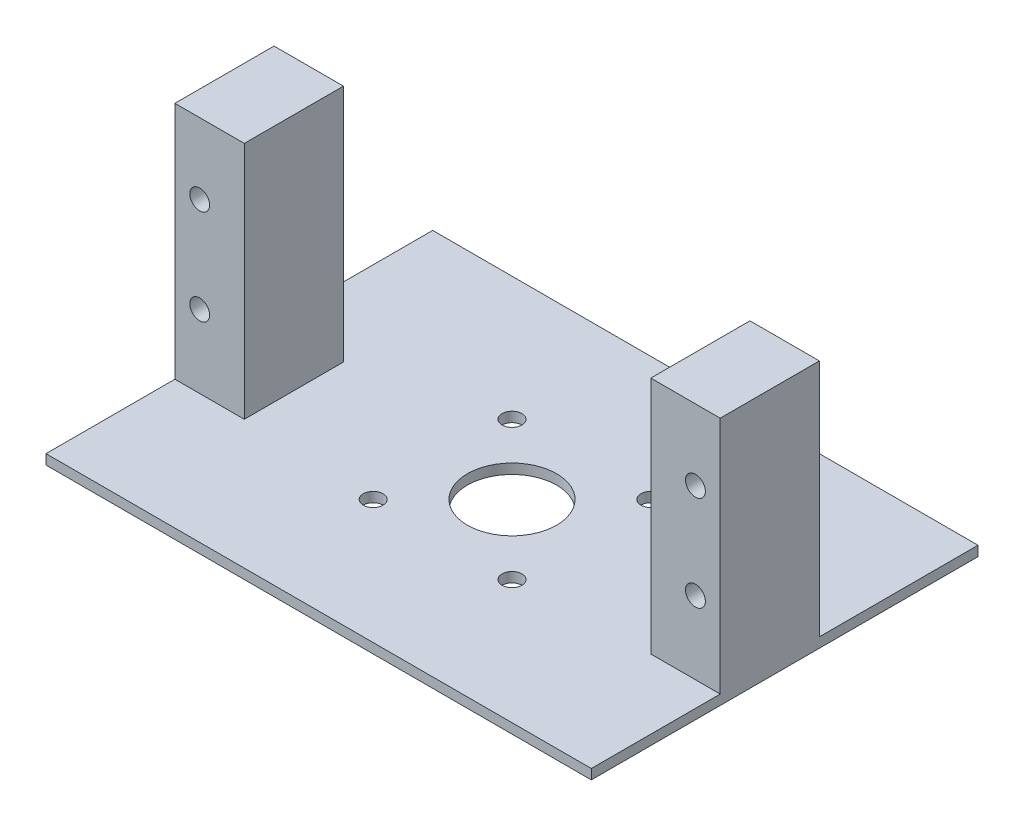
ISO-10303-21;
HEADER;
FILE_DESCRIPTION(('STEP AP214'),'2;1');
FILE_NAME('part.step','',(''),(''),'','','');
FILE_SCHEMA(('AUTOMOTIVE_DESIGN { 1 0 10303 214 1 1 1 1 }'));
ENDSEC;
DATA;
#1=APPLICATION_CONTEXT('core data for automotive mechanical design processes');
#2=APPLICATION_PROTOCOL_DEFINITION('international standard','automotive_design',2000,#1);
#3=PRODUCT_CONTEXT('',#1,'mechanical');
#4=PRODUCT('Part','Part','',(#3));
#5=PRODUCT_RELATED_PRODUCT_CATEGORY('part','',(#4));
#6=PRODUCT_DEFINITION_FORMATION('','',#4);
#7=PRODUCT_DEFINITION_CONTEXT('part definition',#1,'design');
#8=PRODUCT_DEFINITION('design','',#6,#7);
#9=PRODUCT_DEFINITION_SHAPE('','',#8);
#10=(LENGTH_UNIT() NAMED_UNIT(*) SI_UNIT(.MILLI.,.METRE.));
#11=(NAMED_UNIT(*) PLANE_ANGLE_UNIT() SI_UNIT($,.RADIAN.));
#12=(NAMED_UNIT(*) SI_UNIT($,.STERADIAN.) SOLID_ANGLE_UNIT());
#13=UNCERTAINTY_MEASURE_WITH_UNIT(LENGTH_MEASURE(1.E-05),#10,'distance_accuracy_value','');
#14=(GEOMETRIC_REPRESENTATION_CONTEXT(3) GLOBAL_UNCERTAINTY_ASSIGNED_CONTEXT((#13)) GLOBAL_UNIT_ASSIGNED_CONTEXT((#10,
#11,#12)) REPRESENTATION_CONTEXT('',''));
#15=CARTESIAN_POINT('',(0.,0.,0.));
#16=DIRECTION('',(0.,0.,1.));
#17=DIRECTION('',(1.,0.,0.));
#18=AXIS2_PLACEMENT_3D('',#15,#16,#17);
#19=CARTESIAN_POINT('',(0.,1.,0.));
#20=DIRECTION('',(0.,-1.,0.));
#21=DIRECTION('',(0.,0.,-1.));
#22=AXIS2_PLACEMENT_3D('',#19,#20,#21);
#23=PLANE('',#22);
#24=CARTESIAN_POINT('',(20.5,1.,-26.5));
#25=DIRECTION('',(0.,1.,0.));
#26=DIRECTION('',(0.,0.,1.));
#27=AXIS2_PLACEMENT_3D('',#24,#25,#26);
#28=CIRCLE('',#27,1.);
#29=CARTESIAN_POINT('',(20.5,1.,-25.5));
#30=VERTEX_POINT('',#29);
#31=EDGE_CURVE('E161',#30,#30,#28,.T.);
#32=ORIENTED_EDGE('',*,*,#31,.F.);
#33=EDGE_LOOP('',(#32));
#34=FACE_BOUND('',#33,.T.);
#35=CARTESIAN_POINT('',(20.5,1.,-12.5));
#36=DIRECTION('',(0.,1.,0.));
#37=DIRECTION('',(0.,0.,1.));
#38=AXIS2_PLACEMENT_3D('',#35,#36,#37);
#39=CIRCLE('',#38,1.);
#40=CARTESIAN_POINT('',(20.5,1.,-11.5));
#41=VERTEX_POINT('',#40);
#42=EDGE_CURVE('E232',#41,#41,#39,.T.);
#43=ORIENTED_EDGE('',*,*,#42,.F.);
#44=EDGE_LOOP('',(#43));
#45=FACE_BOUND('',#44,.T.);
#46=CARTESIAN_POINT('',(34.5,1.,-12.5));
#47=DIRECTION('',(0.,1.,0.));
#48=DIRECTION('',(0.,0.,1.));
#49=AXIS2_PLACEMENT_3D('',#46,#47,#48);
#50=CIRCLE('',#49,0.999999999999998);
#51=CARTESIAN_POINT('',(34.5,1.,-11.5));
#52=VERTEX_POINT('',#51);
#53=EDGE_CURVE('E224',#52,#52,#50,.T.);
#54=ORIENTED_EDGE('',*,*,#53,.F.);
#55=EDGE_LOOP('',(#54));
#56=FACE_BOUND('',#55,.T.);
#57=CARTESIAN_POINT('',(27.5,1.,-19.5));
#58=DIRECTION('',(0.,1.,0.));
#59=DIRECTION('',(0.,0.,1.));
#60=AXIS2_PLACEMENT_3D('',#57,#58,#59);
#61=CIRCLE('',#60,4.5);
#62=CARTESIAN_POINT('',(27.5,1.,-15.));
#63=VERTEX_POINT('',#62);
#64=EDGE_CURVE('E216',#63,#63,#61,.T.);
#65=ORIENTED_EDGE('',*,*,#64,.F.);
#66=EDGE_LOOP('',(#65));
#67=FACE_BOUND('',#66,.T.);
#68=CARTESIAN_POINT('',(34.5,1.,-26.5));
#69=DIRECTION('',(0.,1.,0.));
#70=DIRECTION('',(0.,0.,1.));
#71=AXIS2_PLACEMENT_3D('',#68,#69,#70);
#72=CIRCLE('',#71,0.999999999999998);
#73=CARTESIAN_POINT('',(34.5,1.,-25.5));
#74=VERTEX_POINT('',#73);
#75=EDGE_CURVE('E239',#74,#74,#72,.T.);
#76=ORIENTED_EDGE('',*,*,#75,.F.);
#77=EDGE_LOOP('',(#76));
#78=FACE_BOUND('',#77,.T.);
#79=DIRECTION('',(1.,0.,0.));
#80=VECTOR('',#79,1.);
#81=CARTESIAN_POINT('',(48.,1.,-13.));
#82=LINE('',#81,#80);
#83=CARTESIAN_POINT('',(48.,1.,-13.));
#84=VERTEX_POINT('',#83);
#85=CARTESIAN_POINT('',(55.,1.,-13.));
#86=VERTEX_POINT('',#85);
#87=EDGE_CURVE('E61',#84,#86,#82,.T.);
#88=ORIENTED_EDGE('',*,*,#87,.F.);
#89=DIRECTION('',(0.,0.,1.));
#90=VECTOR('',#89,1.);
#91=CARTESIAN_POINT('',(48.,1.,-23.));
#92=LINE('',#91,#90);
#93=CARTESIAN_POINT('',(48.,1.,-23.));
#94=VERTEX_POINT('',#93);
#95=EDGE_CURVE('E157',#94,#84,#92,.T.);
#96=ORIENTED_EDGE('',*,*,#95,.F.);
#97=DIRECTION('',(-1.,0.,0.));
#98=VECTOR('',#97,1.);
#99=CARTESIAN_POINT('',(55.,1.,-23.));
#100=LINE('',#99,#98);
#101=CARTESIAN_POINT('',(55.,1.,-23.));
#102=VERTEX_POINT('',#101);
#103=EDGE_CURVE('E300',#102,#94,#100,.T.);
#104=ORIENTED_EDGE('',*,*,#103,.F.);
#105=DIRECTION('',(0.,0.,-1.));
#106=VECTOR('',#105,1.);
#107=CARTESIAN_POINT('',(55.,1.,0.));
#108=LINE('',#107,#106);
#109=CARTESIAN_POINT('',(55.,1.,-39.));
#110=VERTEX_POINT('',#109);
#111=EDGE_CURVE('E254',#102,#110,#108,.T.);
#112=ORIENTED_EDGE('',*,*,#111,.T.);
#113=DIRECTION('',(-1.,0.,0.));
#114=VECTOR('',#113,1.);
#115=CARTESIAN_POINT('',(0.,1.,-39.));
#116=LINE('',#115,#114);
#117=CARTESIAN_POINT('',(0.,1.,-39.));
#118=VERTEX_POINT('',#117);
#119=EDGE_CURVE('E258',#110,#118,#116,.T.);
#120=ORIENTED_EDGE('',*,*,#119,.T.);
#121=DIRECTION('',(0.,0.,1.));
#122=VECTOR('',#121,1.);
#123=CARTESIAN_POINT('',(0.,1.,0.));
#124=LINE('',#123,#122);
#125=CARTESIAN_POINT('',(0.,1.,-23.));
#126=VERTEX_POINT('',#125);
#127=EDGE_CURVE('E247',#118,#126,#124,.T.);
#128=ORIENTED_EDGE('',*,*,#127,.T.);
#129=DIRECTION('',(-1.,0.,0.));
#130=VECTOR('',#129,1.);
#131=CARTESIAN_POINT('',(0.,1.,-23.));
#132=LINE('',#131,#130);
#133=CARTESIAN_POINT('',(7.,1.,-23.));
#134=VERTEX_POINT('',#133);
#135=EDGE_CURVE('E68',#134,#126,#132,.T.);
#136=ORIENTED_EDGE('',*,*,#135,.F.);
#137=DIRECTION('',(0.,0.,-1.));
#138=VECTOR('',#137,1.);
#139=CARTESIAN_POINT('',(7.,1.,-23.));
#140=LINE('',#139,#138);
#141=CARTESIAN_POINT('',(7.,1.,-13.));
#142=VERTEX_POINT('',#141);
#143=EDGE_CURVE('E190',#142,#134,#140,.T.);
#144=ORIENTED_EDGE('',*,*,#143,.F.);
#145=DIRECTION('',(1.,0.,0.));
#146=VECTOR('',#145,1.);
#147=CARTESIAN_POINT('',(7.,1.,-13.));
#148=LINE('',#147,#146);
#149=CARTESIAN_POINT('',(0.,1.,-13.));
#150=VERTEX_POINT('',#149);
#151=EDGE_CURVE('E193',#150,#142,#148,.T.);
#152=ORIENTED_EDGE('',*,*,#151,.F.);
#153=CARTESIAN_POINT('',(0.,1.,0.));
#154=VERTEX_POINT('',#153);
#155=EDGE_CURVE('E251',#150,#154,#124,.T.);
#156=ORIENTED_EDGE('',*,*,#155,.T.);
#157=DIRECTION('',(1.,0.,0.));
#158=VECTOR('',#157,1.);
#159=CARTESIAN_POINT('',(0.,1.,0.));
#160=LINE('',#159,#158);
#161=CARTESIAN_POINT('',(55.,1.,0.));
#162=VERTEX_POINT('',#161);
#163=EDGE_CURVE('E250',#154,#162,#160,.T.);
#164=ORIENTED_EDGE('',*,*,#163,.T.);
#165=EDGE_CURVE('E255',#162,#86,#108,.T.);
#166=ORIENTED_EDGE('',*,*,#165,.T.);
#167=EDGE_LOOP('',(#88,#96,#104,#112,#120,#128,#136,#144,#152,#156,#164,#166));
#168=FACE_BOUND('',#167,.T.);
#169=ADVANCED_FACE('F45',(#34,#45,#56,#67,#78,#168),#23,.F.);
#170=CARTESIAN_POINT('',(0.,1.,0.));
#171=DIRECTION('',(1.,0.,0.));
#172=DIRECTION('',(0.,0.,-1.));
#173=AXIS2_PLACEMENT_3D('',#170,#171,#172);
#174=PLANE('',#173);
#175=DIRECTION('',(0.,0.,1.));
#176=VECTOR('',#175,1.);
#177=CARTESIAN_POINT('',(0.,0.,0.));
#178=LINE('',#177,#176);
#179=CARTESIAN_POINT('',(0.,0.,-39.));
#180=VERTEX_POINT('',#179);
#181=CARTESIAN_POINT('',(0.,0.,0.));
#182=VERTEX_POINT('',#181);
#183=EDGE_CURVE('E243',#180,#182,#178,.T.);
#184=ORIENTED_EDGE('',*,*,#183,.T.);
#185=DIRECTION('',(0.,-1.,0.));
#186=VECTOR('',#185,1.);
#187=CARTESIAN_POINT('',(0.,1.,0.));
#188=LINE('',#187,#186);
#189=EDGE_CURVE('E11',#154,#182,#188,.T.);
#190=ORIENTED_EDGE('',*,*,#189,.F.);
#191=ORIENTED_EDGE('',*,*,#155,.F.);
#192=DIRECTION('',(0.,-1.,0.));
#193=VECTOR('',#192,1.);
#194=CARTESIAN_POINT('',(0.,25.1,-13.));
#195=LINE('',#194,#193);
#196=CARTESIAN_POINT('',(0.,25.1,-13.));
#197=VERTEX_POINT('',#196);
#198=EDGE_CURVE('E176',#197,#150,#195,.T.);
#199=ORIENTED_EDGE('',*,*,#198,.F.);
#200=DIRECTION('',(0.,0.,1.));
#201=VECTOR('',#200,1.);
#202=CARTESIAN_POINT('',(0.,25.1,-13.));
#203=LINE('',#202,#201);
#204=CARTESIAN_POINT('',(0.,25.1,-23.));
#205=VERTEX_POINT('',#204);
#206=EDGE_CURVE('E205',#205,#197,#203,.T.);
#207=ORIENTED_EDGE('',*,*,#206,.F.);
#208=DIRECTION('',(0.,-1.,0.));
#209=VECTOR('',#208,1.);
#210=CARTESIAN_POINT('',(0.,25.1,-23.));
#211=LINE('',#210,#209);
#212=EDGE_CURVE('E172',#205,#126,#211,.T.);
#213=ORIENTED_EDGE('',*,*,#212,.T.);
#214=ORIENTED_EDGE('',*,*,#127,.F.);
#215=DIRECTION('',(0.,-1.,0.));
#216=VECTOR('',#215,1.);
#217=CARTESIAN_POINT('',(0.,1.,-39.));
#218=LINE('',#217,#216);
#219=EDGE_CURVE('E261',#118,#180,#218,.T.);
#220=ORIENTED_EDGE('',*,*,#219,.T.);
#221=EDGE_LOOP('',(#184,#190,#191,#199,#207,#213,#214,#220));
#222=FACE_BOUND('',#221,.T.);
#223=ADVANCED_FACE('F47',(#222),#174,.F.);
#224=CARTESIAN_POINT('',(0.,1.,0.));
#225=DIRECTION('',(0.,0.,-1.));
#226=DIRECTION('',(-1.,0.,0.));
#227=AXIS2_PLACEMENT_3D('',#224,#225,#226);
#228=PLANE('',#227);
#229=DIRECTION('',(1.,0.,0.));
#230=VECTOR('',#229,1.);
#231=CARTESIAN_POINT('',(0.,0.,0.));
#232=LINE('',#231,#230);
#233=CARTESIAN_POINT('',(55.,0.,0.));
#234=VERTEX_POINT('',#233);
#235=EDGE_CURVE('E265',#182,#234,#232,.T.);
#236=ORIENTED_EDGE('',*,*,#235,.T.);
#237=DIRECTION('',(0.,-1.,0.));
#238=VECTOR('',#237,1.);
#239=CARTESIAN_POINT('',(55.,1.,0.));
#240=LINE('',#239,#238);
#241=EDGE_CURVE('E54',#162,#234,#240,.T.);
#242=ORIENTED_EDGE('',*,*,#241,.F.);
#243=ORIENTED_EDGE('',*,*,#163,.F.);
#244=ORIENTED_EDGE('',*,*,#189,.T.);
#245=EDGE_LOOP('',(#236,#242,#243,#244));
#246=FACE_BOUND('',#245,.T.);
#247=ADVANCED_FACE('F305',(#246),#228,.F.);
#248=CARTESIAN_POINT('',(55.,1.,0.));
#249=DIRECTION('',(-1.,0.,0.));
#250=DIRECTION('',(0.,0.,1.));
#251=AXIS2_PLACEMENT_3D('',#248,#249,#250);
#252=PLANE('',#251);
#253=DIRECTION('',(0.,0.,-1.));
#254=VECTOR('',#253,1.);
#255=CARTESIAN_POINT('',(55.,0.,0.));
#256=LINE('',#255,#254);
#257=CARTESIAN_POINT('',(55.,0.,-39.));
#258=VERTEX_POINT('',#257);
#259=EDGE_CURVE('E268',#234,#258,#256,.T.);
#260=ORIENTED_EDGE('',*,*,#259,.T.);
#261=DIRECTION('',(0.,-1.,0.));
#262=VECTOR('',#261,1.);
#263=CARTESIAN_POINT('',(55.,1.,-39.));
#264=LINE('',#263,#262);
#265=EDGE_CURVE('E277',#110,#258,#264,.T.);
#266=ORIENTED_EDGE('',*,*,#265,.F.);
#267=ORIENTED_EDGE('',*,*,#111,.F.);
#268=DIRECTION('',(0.,-1.,0.));
#269=VECTOR('',#268,1.);
#270=CARTESIAN_POINT('',(55.,25.1,-23.));
#271=LINE('',#270,#269);
#272=CARTESIAN_POINT('',(55.,25.1,-23.));
#273=VERTEX_POINT('',#272);
#274=EDGE_CURVE('E142',#273,#102,#271,.T.);
#275=ORIENTED_EDGE('',*,*,#274,.F.);
#276=DIRECTION('',(0.,0.,-1.));
#277=VECTOR('',#276,1.);
#278=CARTESIAN_POINT('',(55.,25.1,-13.));
#279=LINE('',#278,#277);
#280=CARTESIAN_POINT('',(55.,25.1,-13.));
#281=VERTEX_POINT('',#280);
#282=EDGE_CURVE('E134',#281,#273,#279,.T.);
#283=ORIENTED_EDGE('',*,*,#282,.F.);
#284=DIRECTION('',(0.,-1.,0.));
#285=VECTOR('',#284,1.);
#286=CARTESIAN_POINT('',(55.,25.1,-13.));
#287=LINE('',#286,#285);
#288=EDGE_CURVE('E139',#281,#86,#287,.T.);
#289=ORIENTED_EDGE('',*,*,#288,.T.);
#290=ORIENTED_EDGE('',*,*,#165,.F.);
#291=ORIENTED_EDGE('',*,*,#241,.T.);
#292=EDGE_LOOP('',(#260,#266,#267,#275,#283,#289,#290,#291));
#293=FACE_BOUND('',#292,.T.);
#294=ADVANCED_FACE('F136',(#293),#252,.F.);
#295=CARTESIAN_POINT('',(0.,1.,-39.));
#296=DIRECTION('',(0.,0.,1.));
#297=DIRECTION('',(1.,0.,0.));
#298=AXIS2_PLACEMENT_3D('',#295,#296,#297);
#299=PLANE('',#298);
#300=DIRECTION('',(-1.,0.,0.));
#301=VECTOR('',#300,1.);
#302=CARTESIAN_POINT('',(0.,0.,-39.));
#303=LINE('',#302,#301);
#304=EDGE_CURVE('E271',#258,#180,#303,.T.);
#305=ORIENTED_EDGE('',*,*,#304,.T.);
#306=ORIENTED_EDGE('',*,*,#219,.F.);
#307=ORIENTED_EDGE('',*,*,#119,.F.);
#308=ORIENTED_EDGE('',*,*,#265,.T.);
#309=EDGE_LOOP('',(#305,#306,#307,#308));
#310=FACE_BOUND('',#309,.T.);
#311=ADVANCED_FACE('F293',(#310),#299,.F.);
#312=CARTESIAN_POINT('',(0.,0.,0.));
#313=DIRECTION('',(0.,-1.,0.));
#314=DIRECTION('',(0.,0.,-1.));
#315=AXIS2_PLACEMENT_3D('',#312,#313,#314);
#316=PLANE('',#315);
#317=CARTESIAN_POINT('',(20.5,0.,-26.5));
#318=DIRECTION('',(0.,-1.,0.));
#319=DIRECTION('',(0.,0.,-1.));
#320=AXIS2_PLACEMENT_3D('',#317,#318,#319);
#321=CIRCLE('',#320,1.);
#322=CARTESIAN_POINT('',(20.5,0.,-27.5));
#323=VERTEX_POINT('',#322);
#324=EDGE_CURVE('E166',#323,#323,#321,.F.);
#325=ORIENTED_EDGE('',*,*,#324,.T.);
#326=EDGE_LOOP('',(#325));
#327=FACE_BOUND('',#326,.T.);
#328=CARTESIAN_POINT('',(20.5,0.,-12.5));
#329=DIRECTION('',(0.,-1.,0.));
#330=DIRECTION('',(0.,0.,-1.));
#331=AXIS2_PLACEMENT_3D('',#328,#329,#330);
#332=CIRCLE('',#331,1.);
#333=CARTESIAN_POINT('',(20.5,0.,-13.5));
#334=VERTEX_POINT('',#333);
#335=EDGE_CURVE('E228',#334,#334,#332,.F.);
#336=ORIENTED_EDGE('',*,*,#335,.T.);
#337=EDGE_LOOP('',(#336));
#338=FACE_BOUND('',#337,.T.);
#339=CARTESIAN_POINT('',(34.5,0.,-12.5));
#340=DIRECTION('',(0.,-1.,0.));
#341=DIRECTION('',(0.,0.,-1.));
#342=AXIS2_PLACEMENT_3D('',#339,#340,#341);
#343=CIRCLE('',#342,0.999999999999998);
#344=CARTESIAN_POINT('',(34.5,0.,-13.5));
#345=VERTEX_POINT('',#344);
#346=EDGE_CURVE('E220',#345,#345,#343,.F.);
#347=ORIENTED_EDGE('',*,*,#346,.T.);
#348=EDGE_LOOP('',(#347));
#349=FACE_BOUND('',#348,.T.);
#350=CARTESIAN_POINT('',(27.5,0.,-19.5));
#351=DIRECTION('',(0.,-1.,0.));
#352=DIRECTION('',(0.,0.,-1.));
#353=AXIS2_PLACEMENT_3D('',#350,#351,#352);
#354=CIRCLE('',#353,4.5);
#355=CARTESIAN_POINT('',(27.5,0.,-24.));
#356=VERTEX_POINT('',#355);
#357=EDGE_CURVE('E211',#356,#356,#354,.F.);
#358=ORIENTED_EDGE('',*,*,#357,.T.);
#359=EDGE_LOOP('',(#358));
#360=FACE_BOUND('',#359,.T.);
#361=CARTESIAN_POINT('',(34.5,0.,-26.5));
#362=DIRECTION('',(0.,-1.,0.));
#363=DIRECTION('',(0.,0.,-1.));
#364=AXIS2_PLACEMENT_3D('',#361,#362,#363);
#365=CIRCLE('',#364,0.999999999999998);
#366=CARTESIAN_POINT('',(34.5,0.,-27.5));
#367=VERTEX_POINT('',#366);
#368=EDGE_CURVE('E215',#367,#367,#365,.F.);
#369=ORIENTED_EDGE('',*,*,#368,.T.);
#370=EDGE_LOOP('',(#369));
#371=FACE_BOUND('',#370,.T.);
#372=ORIENTED_EDGE('',*,*,#183,.F.);
#373=ORIENTED_EDGE('',*,*,#304,.F.);
#374=ORIENTED_EDGE('',*,*,#259,.F.);
#375=ORIENTED_EDGE('',*,*,#235,.F.);
#376=EDGE_LOOP('',(#372,#373,#374,#375));
#377=FACE_BOUND('',#376,.T.);
#378=ADVANCED_FACE('F290',(#327,#338,#349,#360,#371,#377),#316,.T.);
#379=CARTESIAN_POINT('',(34.5,-0.000999999999999916,-26.5));
#380=DIRECTION('',(0.,1.,0.));
#381=DIRECTION('',(0.,0.,1.));
#382=AXIS2_PLACEMENT_3D('',#379,#380,#381);
#383=CYLINDRICAL_SURFACE('',#382,0.999999999999998);
#384=ORIENTED_EDGE('',*,*,#368,.F.);
#385=EDGE_LOOP('',(#384));
#386=FACE_BOUND('',#385,.T.);
#387=ORIENTED_EDGE('',*,*,#75,.T.);
#388=EDGE_LOOP('',(#387));
#389=FACE_BOUND('',#388,.T.);
#390=ADVANCED_FACE('F323',(#386,#389),#383,.F.);
#391=CARTESIAN_POINT('',(27.5,-0.000999999999999916,-19.5));
#392=DIRECTION('',(0.,1.,0.));
#393=DIRECTION('',(0.,0.,1.));
#394=AXIS2_PLACEMENT_3D('',#391,#392,#393);
#395=CYLINDRICAL_SURFACE('',#394,4.5);
#396=ORIENTED_EDGE('',*,*,#357,.F.);
#397=EDGE_LOOP('',(#396));
#398=FACE_BOUND('',#397,.T.);
#399=ORIENTED_EDGE('',*,*,#64,.T.);
#400=EDGE_LOOP('',(#399));
#401=FACE_BOUND('',#400,.T.);
#402=ADVANCED_FACE('F343',(#398,#401),#395,.F.);
#403=CARTESIAN_POINT('',(34.5,-0.000999999999999916,-12.5));
#404=DIRECTION('',(0.,1.,0.));
#405=DIRECTION('',(0.,0.,1.));
#406=AXIS2_PLACEMENT_3D('',#403,#404,#405);
#407=CYLINDRICAL_SURFACE('',#406,0.999999999999998);
#408=ORIENTED_EDGE('',*,*,#346,.F.);
#409=EDGE_LOOP('',(#408));
#410=FACE_BOUND('',#409,.T.);
#411=ORIENTED_EDGE('',*,*,#53,.T.);
#412=EDGE_LOOP('',(#411));
#413=FACE_BOUND('',#412,.T.);
#414=ADVANCED_FACE('F351',(#410,#413),#407,.F.);
#415=CARTESIAN_POINT('',(20.5,-0.000999999999999916,-12.5));
#416=DIRECTION('',(0.,1.,0.));
#417=DIRECTION('',(0.,0.,1.));
#418=AXIS2_PLACEMENT_3D('',#415,#416,#417);
#419=CYLINDRICAL_SURFACE('',#418,1.);
#420=ORIENTED_EDGE('',*,*,#335,.F.);
#421=EDGE_LOOP('',(#420));
#422=FACE_BOUND('',#421,.T.);
#423=ORIENTED_EDGE('',*,*,#42,.T.);
#424=EDGE_LOOP('',(#423));
#425=FACE_BOUND('',#424,.T.);
#426=ADVANCED_FACE('F360',(#422,#425),#419,.F.);
#427=CARTESIAN_POINT('',(20.5,-0.000999999999999916,-26.5));
#428=DIRECTION('',(0.,1.,0.));
#429=DIRECTION('',(0.,0.,1.));
#430=AXIS2_PLACEMENT_3D('',#427,#428,#429);
#431=CYLINDRICAL_SURFACE('',#430,1.);
#432=ORIENTED_EDGE('',*,*,#324,.F.);
#433=EDGE_LOOP('',(#432));
#434=FACE_BOUND('',#433,.T.);
#435=ORIENTED_EDGE('',*,*,#31,.T.);
#436=EDGE_LOOP('',(#435));
#437=FACE_BOUND('',#436,.T.);
#438=ADVANCED_FACE('F368',(#434,#437),#431,.F.);
#439=CARTESIAN_POINT('',(0.,25.1,-23.));
#440=DIRECTION('',(0.,0.,1.));
#441=DIRECTION('',(1.,0.,0.));
#442=AXIS2_PLACEMENT_3D('',#439,#440,#441);
#443=PLANE('',#442);
#444=CARTESIAN_POINT('',(2.5,8.35,-23.));
#445=DIRECTION('',(0.,0.,1.));
#446=DIRECTION('',(1.,0.,0.));
#447=AXIS2_PLACEMENT_3D('',#444,#445,#446);
#448=CIRCLE('',#447,1.);
#449=CARTESIAN_POINT('',(3.5,8.35,-23.));
#450=VERTEX_POINT('',#449);
#451=EDGE_CURVE('E523',#450,#450,#448,.F.);
#452=ORIENTED_EDGE('',*,*,#451,.F.);
#453=EDGE_LOOP('',(#452));
#454=FACE_BOUND('',#453,.T.);
#455=CARTESIAN_POINT('',(2.5,17.95,-23.));
#456=DIRECTION('',(0.,0.,1.));
#457=DIRECTION('',(1.,0.,0.));
#458=AXIS2_PLACEMENT_3D('',#455,#456,#457);
#459=CIRCLE('',#458,1.);
#460=CARTESIAN_POINT('',(3.5,17.95,-23.));
#461=VERTEX_POINT('',#460);
#462=EDGE_CURVE('E177',#461,#461,#459,.F.);
#463=ORIENTED_EDGE('',*,*,#462,.F.);
#464=EDGE_LOOP('',(#463));
#465=FACE_BOUND('',#464,.T.);
#466=ORIENTED_EDGE('',*,*,#135,.T.);
#467=ORIENTED_EDGE('',*,*,#212,.F.);
#468=DIRECTION('',(-1.,0.,0.));
#469=VECTOR('',#468,1.);
#470=CARTESIAN_POINT('',(0.,25.1,-23.));
#471=LINE('',#470,#469);
#472=CARTESIAN_POINT('',(7.,25.1,-23.));
#473=VERTEX_POINT('',#472);
#474=EDGE_CURVE('E194',#473,#205,#471,.T.);
#475=ORIENTED_EDGE('',*,*,#474,.F.);
#476=DIRECTION('',(0.,-1.,0.));
#477=VECTOR('',#476,1.);
#478=CARTESIAN_POINT('',(7.,25.1,-23.));
#479=LINE('',#478,#477);
#480=EDGE_CURVE('E185',#473,#134,#479,.T.);
#481=ORIENTED_EDGE('',*,*,#480,.T.);
#482=EDGE_LOOP('',(#466,#467,#475,#481));
#483=FACE_BOUND('',#482,.T.);
#484=ADVANCED_FACE('F376',(#454,#465,#483),#443,.F.);
#485=CARTESIAN_POINT('',(7.,25.1,-13.));
#486=DIRECTION('',(0.,0.,-1.));
#487=DIRECTION('',(-1.,0.,0.));
#488=AXIS2_PLACEMENT_3D('',#485,#486,#487);
#489=PLANE('',#488);
#490=CARTESIAN_POINT('',(2.5,8.35,-13.));
#491=DIRECTION('',(0.,0.,1.));
#492=DIRECTION('',(-1.,0.,0.));
#493=AXIS2_PLACEMENT_3D('',#490,#491,#492);
#494=CIRCLE('',#493,1.);
#495=CARTESIAN_POINT('',(1.5,8.35,-13.));
#496=VERTEX_POINT('',#495);
#497=EDGE_CURVE('E520',#496,#496,#494,.T.);
#498=ORIENTED_EDGE('',*,*,#497,.F.);
#499=EDGE_LOOP('',(#498));
#500=FACE_BOUND('',#499,.T.);
#501=CARTESIAN_POINT('',(2.5,17.95,-13.));
#502=DIRECTION('',(0.,0.,1.));
#503=DIRECTION('',(1.,0.,0.));
#504=AXIS2_PLACEMENT_3D('',#501,#502,#503);
#505=CIRCLE('',#504,1.);
#506=CARTESIAN_POINT('',(3.5,17.95,-13.));
#507=VERTEX_POINT('',#506);
#508=EDGE_CURVE('E529',#507,#507,#505,.T.);
#509=ORIENTED_EDGE('',*,*,#508,.F.);
#510=EDGE_LOOP('',(#509));
#511=FACE_BOUND('',#510,.T.);
#512=ORIENTED_EDGE('',*,*,#151,.T.);
#513=DIRECTION('',(0.,-1.,0.));
#514=VECTOR('',#513,1.);
#515=CARTESIAN_POINT('',(7.,25.1,-13.));
#516=LINE('',#515,#514);
#517=CARTESIAN_POINT('',(7.,25.1,-13.));
#518=VERTEX_POINT('',#517);
#519=EDGE_CURVE('E181',#518,#142,#516,.T.);
#520=ORIENTED_EDGE('',*,*,#519,.F.);
#521=DIRECTION('',(1.,0.,0.));
#522=VECTOR('',#521,1.);
#523=CARTESIAN_POINT('',(7.,25.1,-13.));
#524=LINE('',#523,#522);
#525=EDGE_CURVE('E202',#197,#518,#524,.T.);
#526=ORIENTED_EDGE('',*,*,#525,.F.);
#527=ORIENTED_EDGE('',*,*,#198,.T.);
#528=EDGE_LOOP('',(#512,#520,#526,#527));
#529=FACE_BOUND('',#528,.T.);
#530=ADVANCED_FACE('F408',(#500,#511,#529),#489,.F.);
#531=CARTESIAN_POINT('',(7.,25.1,-23.));
#532=DIRECTION('',(-1.,0.,0.));
#533=DIRECTION('',(0.,0.,1.));
#534=AXIS2_PLACEMENT_3D('',#531,#532,#533);
#535=PLANE('',#534);
#536=ORIENTED_EDGE('',*,*,#143,.T.);
#537=ORIENTED_EDGE('',*,*,#480,.F.);
#538=DIRECTION('',(0.,0.,-1.));
#539=VECTOR('',#538,1.);
#540=CARTESIAN_POINT('',(7.,25.1,-23.));
#541=LINE('',#540,#539);
#542=EDGE_CURVE('E189',#518,#473,#541,.T.);
#543=ORIENTED_EDGE('',*,*,#542,.F.);
#544=ORIENTED_EDGE('',*,*,#519,.T.);
#545=EDGE_LOOP('',(#536,#537,#543,#544));
#546=FACE_BOUND('',#545,.T.);
#547=ADVANCED_FACE('F419',(#546),#535,.F.);
#548=CARTESIAN_POINT('',(0.,25.1,0.));
#549=DIRECTION('',(0.,-1.,0.));
#550=DIRECTION('',(0.,0.,-1.));
#551=AXIS2_PLACEMENT_3D('',#548,#549,#550);
#552=PLANE('',#551);
#553=ORIENTED_EDGE('',*,*,#474,.T.);
#554=ORIENTED_EDGE('',*,*,#206,.T.);
#555=ORIENTED_EDGE('',*,*,#525,.T.);
#556=ORIENTED_EDGE('',*,*,#542,.T.);
#557=EDGE_LOOP('',(#553,#554,#555,#556));
#558=FACE_BOUND('',#557,.T.);
#559=ADVANCED_FACE('F429',(#558),#552,.F.);
#560=CARTESIAN_POINT('',(48.,25.1,-13.));
#561=DIRECTION('',(0.,0.,-1.));
#562=DIRECTION('',(-1.,0.,0.));
#563=AXIS2_PLACEMENT_3D('',#560,#561,#562);
#564=PLANE('',#563);
#565=CARTESIAN_POINT('',(52.5,17.95,-13.));
#566=DIRECTION('',(0.,0.,1.));
#567=DIRECTION('',(-1.,0.,0.));
#568=AXIS2_PLACEMENT_3D('',#565,#566,#567);
#569=CIRCLE('',#568,1.00000000000001);
#570=CARTESIAN_POINT('',(51.5,17.95,-13.));
#571=VERTEX_POINT('',#570);
#572=EDGE_CURVE('E537',#571,#571,#569,.T.);
#573=ORIENTED_EDGE('',*,*,#572,.F.);
#574=EDGE_LOOP('',(#573));
#575=FACE_BOUND('',#574,.T.);
#576=CARTESIAN_POINT('',(52.5,8.35,-13.));
#577=DIRECTION('',(0.,0.,1.));
#578=DIRECTION('',(1.,0.,0.));
#579=AXIS2_PLACEMENT_3D('',#576,#577,#578);
#580=CIRCLE('',#579,0.999999999999998);
#581=CARTESIAN_POINT('',(53.5,8.35,-13.));
#582=VERTEX_POINT('',#581);
#583=EDGE_CURVE('E525',#582,#582,#580,.T.);
#584=ORIENTED_EDGE('',*,*,#583,.F.);
#585=EDGE_LOOP('',(#584));
#586=FACE_BOUND('',#585,.T.);
#587=ORIENTED_EDGE('',*,*,#87,.T.);
#588=ORIENTED_EDGE('',*,*,#288,.F.);
#589=DIRECTION('',(1.,0.,0.));
#590=VECTOR('',#589,1.);
#591=CARTESIAN_POINT('',(48.,25.1,-13.));
#592=LINE('',#591,#590);
#593=CARTESIAN_POINT('',(48.,25.1,-13.));
#594=VERTEX_POINT('',#593);
#595=EDGE_CURVE('E147',#594,#281,#592,.T.);
#596=ORIENTED_EDGE('',*,*,#595,.F.);
#597=DIRECTION('',(0.,-1.,0.));
#598=VECTOR('',#597,1.);
#599=CARTESIAN_POINT('',(48.,25.1,-13.));
#600=LINE('',#599,#598);
#601=EDGE_CURVE('E556',#594,#84,#600,.T.);
#602=ORIENTED_EDGE('',*,*,#601,.T.);
#603=EDGE_LOOP('',(#587,#588,#596,#602));
#604=FACE_BOUND('',#603,.T.);
#605=ADVANCED_FACE('F159',(#575,#586,#604),#564,.F.);
#606=CARTESIAN_POINT('',(55.,25.1,-23.));
#607=DIRECTION('',(0.,0.,1.));
#608=DIRECTION('',(1.,0.,0.));
#609=AXIS2_PLACEMENT_3D('',#606,#607,#608);
#610=PLANE('',#609);
#611=CARTESIAN_POINT('',(52.5,17.95,-23.));
#612=DIRECTION('',(0.,0.,1.));
#613=DIRECTION('',(1.,0.,0.));
#614=AXIS2_PLACEMENT_3D('',#611,#612,#613);
#615=CIRCLE('',#614,1.00000000000001);
#616=CARTESIAN_POINT('',(53.5,17.95,-23.));
#617=VERTEX_POINT('',#616);
#618=EDGE_CURVE('E539',#617,#617,#615,.F.);
#619=ORIENTED_EDGE('',*,*,#618,.F.);
#620=EDGE_LOOP('',(#619));
#621=FACE_BOUND('',#620,.T.);
#622=CARTESIAN_POINT('',(52.5,8.35,-23.));
#623=DIRECTION('',(0.,0.,1.));
#624=DIRECTION('',(1.,0.,0.));
#625=AXIS2_PLACEMENT_3D('',#622,#623,#624);
#626=CIRCLE('',#625,0.999999999999998);
#627=CARTESIAN_POINT('',(53.5,8.35,-23.));
#628=VERTEX_POINT('',#627);
#629=EDGE_CURVE('E532',#628,#628,#626,.F.);
#630=ORIENTED_EDGE('',*,*,#629,.F.);
#631=EDGE_LOOP('',(#630));
#632=FACE_BOUND('',#631,.T.);
#633=ORIENTED_EDGE('',*,*,#103,.T.);
#634=DIRECTION('',(0.,-1.,0.));
#635=VECTOR('',#634,1.);
#636=CARTESIAN_POINT('',(48.,25.1,-23.));
#637=LINE('',#636,#635);
#638=CARTESIAN_POINT('',(48.,25.1,-23.));
#639=VERTEX_POINT('',#638);
#640=EDGE_CURVE('E168',#639,#94,#637,.T.);
#641=ORIENTED_EDGE('',*,*,#640,.F.);
#642=DIRECTION('',(-1.,0.,0.));
#643=VECTOR('',#642,1.);
#644=CARTESIAN_POINT('',(55.,25.1,-23.));
#645=LINE('',#644,#643);
#646=EDGE_CURVE('E146',#273,#639,#645,.T.);
#647=ORIENTED_EDGE('',*,*,#646,.F.);
#648=ORIENTED_EDGE('',*,*,#274,.T.);
#649=EDGE_LOOP('',(#633,#641,#647,#648));
#650=FACE_BOUND('',#649,.T.);
#651=ADVANCED_FACE('F448',(#621,#632,#650),#610,.F.);
#652=CARTESIAN_POINT('',(48.,25.1,-23.));
#653=DIRECTION('',(1.,0.,0.));
#654=DIRECTION('',(0.,0.,-1.));
#655=AXIS2_PLACEMENT_3D('',#652,#653,#654);
#656=PLANE('',#655);
#657=ORIENTED_EDGE('',*,*,#95,.T.);
#658=ORIENTED_EDGE('',*,*,#601,.F.);
#659=DIRECTION('',(0.,0.,1.));
#660=VECTOR('',#659,1.);
#661=CARTESIAN_POINT('',(48.,25.1,-23.));
#662=LINE('',#661,#660);
#663=EDGE_CURVE('E152',#639,#594,#662,.T.);
#664=ORIENTED_EDGE('',*,*,#663,.F.);
#665=ORIENTED_EDGE('',*,*,#640,.T.);
#666=EDGE_LOOP('',(#657,#658,#664,#665));
#667=FACE_BOUND('',#666,.T.);
#668=ADVANCED_FACE('F458',(#667),#656,.F.);
#669=CARTESIAN_POINT('',(0.,25.1,0.));
#670=DIRECTION('',(0.,1.,0.));
#671=DIRECTION('',(0.,0.,1.));
#672=AXIS2_PLACEMENT_3D('',#669,#670,#671);
#673=PLANE('',#672);
#674=ORIENTED_EDGE('',*,*,#595,.T.);
#675=ORIENTED_EDGE('',*,*,#282,.T.);
#676=ORIENTED_EDGE('',*,*,#646,.T.);
#677=ORIENTED_EDGE('',*,*,#663,.T.);
#678=EDGE_LOOP('',(#674,#675,#676,#677));
#679=FACE_BOUND('',#678,.T.);
#680=ADVANCED_FACE('F150',(#679),#673,.T.);
#681=CARTESIAN_POINT('',(52.5,8.35,-39.001));
#682=DIRECTION('',(0.,0.,1.));
#683=DIRECTION('',(1.,0.,0.));
#684=AXIS2_PLACEMENT_3D('',#681,#682,#683);
#685=CYLINDRICAL_SURFACE('',#684,0.999999999999998);
#686=ORIENTED_EDGE('',*,*,#583,.T.);
#687=EDGE_LOOP('',(#686));
#688=FACE_BOUND('',#687,.T.);
#689=ORIENTED_EDGE('',*,*,#629,.T.);
#690=EDGE_LOOP('',(#689));
#691=FACE_BOUND('',#690,.T.);
#692=ADVANCED_FACE('F476',(#688,#691),#685,.F.);
#693=CARTESIAN_POINT('',(52.5,17.95,-39.001));
#694=DIRECTION('',(0.,0.,1.));
#695=DIRECTION('',(1.,0.,0.));
#696=AXIS2_PLACEMENT_3D('',#693,#694,#695);
#697=CYLINDRICAL_SURFACE('',#696,1.00000000000001);
#698=ORIENTED_EDGE('',*,*,#572,.T.);
#699=EDGE_LOOP('',(#698));
#700=FACE_BOUND('',#699,.T.);
#701=ORIENTED_EDGE('',*,*,#618,.T.);
#702=EDGE_LOOP('',(#701));
#703=FACE_BOUND('',#702,.T.);
#704=ADVANCED_FACE('F484',(#700,#703),#697,.F.);
#705=CARTESIAN_POINT('',(2.5,17.95,-39.001));
#706=DIRECTION('',(0.,0.,1.));
#707=DIRECTION('',(1.,0.,0.));
#708=AXIS2_PLACEMENT_3D('',#705,#706,#707);
#709=CYLINDRICAL_SURFACE('',#708,1.);
#710=ORIENTED_EDGE('',*,*,#508,.T.);
#711=EDGE_LOOP('',(#710));
#712=FACE_BOUND('',#711,.T.);
#713=ORIENTED_EDGE('',*,*,#462,.T.);
#714=EDGE_LOOP('',(#713));
#715=FACE_BOUND('',#714,.T.);
#716=ADVANCED_FACE('F494',(#712,#715),#709,.F.);
#717=CARTESIAN_POINT('',(2.5,8.35,-39.001));
#718=DIRECTION('',(0.,0.,1.));
#719=DIRECTION('',(1.,0.,0.));
#720=AXIS2_PLACEMENT_3D('',#717,#718,#719);
#721=CYLINDRICAL_SURFACE('',#720,1.);
#722=ORIENTED_EDGE('',*,*,#497,.T.);
#723=EDGE_LOOP('',(#722));
#724=FACE_BOUND('',#723,.T.);
#725=ORIENTED_EDGE('',*,*,#451,.T.);
#726=EDGE_LOOP('',(#725));
#727=FACE_BOUND('',#726,.T.);
#728=ADVANCED_FACE('F504',(#724,#727),#721,.F.);
#729=CLOSED_SHELL('',(#169,#223,#247,#294,#311,#378,#390,#402,#414,#426,#438,#484,#530,#547,
#559,#605,#651,#668,#680,#692,#704,#716,#728));
#730=MANIFOLD_SOLID_BREP('B2',#729);
#731=ADVANCED_BREP_SHAPE_REPRESENTATION('',(#18,#730),#14);
#732=SHAPE_DEFINITION_REPRESENTATION(#9,#731);
ENDSEC;
END-ISO-10303-21;
